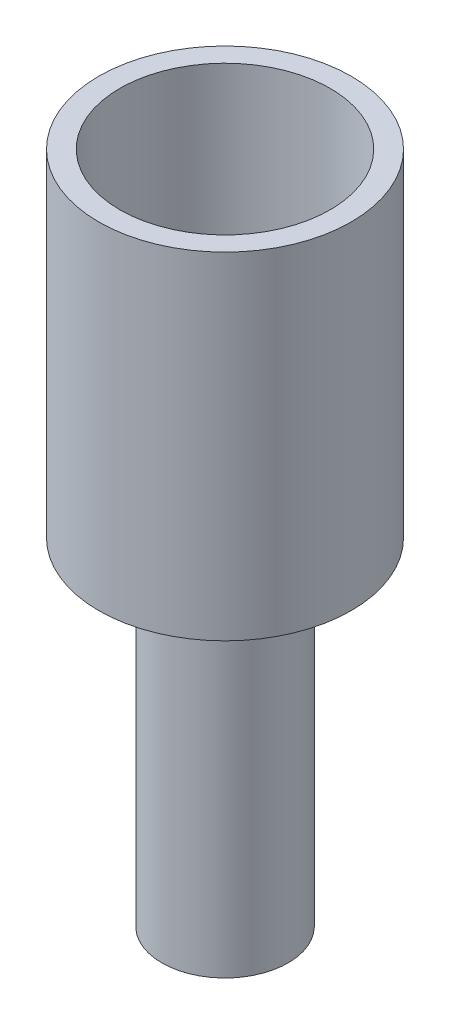
ISO-10303-21;
HEADER;
FILE_DESCRIPTION(('STEP AP214'),'2;1');
FILE_NAME('part.step','',(''),(''),'','','');
FILE_SCHEMA(('AUTOMOTIVE_DESIGN { 1 0 10303 214 1 1 1 1 }'));
ENDSEC;
DATA;
#1=APPLICATION_CONTEXT('core data for automotive mechanical design processes');
#2=APPLICATION_PROTOCOL_DEFINITION('international standard','automotive_design',2000,#1);
#3=PRODUCT_CONTEXT('',#1,'mechanical');
#4=PRODUCT('Part','Part','',(#3));
#5=PRODUCT_RELATED_PRODUCT_CATEGORY('part','',(#4));
#6=PRODUCT_DEFINITION_FORMATION('','',#4);
#7=PRODUCT_DEFINITION_CONTEXT('part definition',#1,'design');
#8=PRODUCT_DEFINITION('design','',#6,#7);
#9=PRODUCT_DEFINITION_SHAPE('','',#8);
#10=(LENGTH_UNIT() NAMED_UNIT(*) SI_UNIT(.MILLI.,.METRE.));
#11=(NAMED_UNIT(*) PLANE_ANGLE_UNIT() SI_UNIT($,.RADIAN.));
#12=(NAMED_UNIT(*) SI_UNIT($,.STERADIAN.) SOLID_ANGLE_UNIT());
#13=UNCERTAINTY_MEASURE_WITH_UNIT(LENGTH_MEASURE(1.E-05),#10,'distance_accuracy_value','');
#14=(GEOMETRIC_REPRESENTATION_CONTEXT(3) GLOBAL_UNCERTAINTY_ASSIGNED_CONTEXT((#13)) GLOBAL_UNIT_ASSIGNED_CONTEXT((#10,
#11,#12)) REPRESENTATION_CONTEXT('',''));
#15=CARTESIAN_POINT('',(0.,0.,0.));
#16=DIRECTION('',(0.,0.,1.));
#17=DIRECTION('',(1.,0.,0.));
#18=AXIS2_PLACEMENT_3D('',#15,#16,#17);
#19=CARTESIAN_POINT('',(0.,0.,0.));
#20=DIRECTION('',(0.,1.,0.));
#21=DIRECTION('',(0.,0.,1.));
#22=AXIS2_PLACEMENT_3D('',#19,#20,#21);
#23=PLANE('',#22);
#24=CARTESIAN_POINT('',(0.,0.,0.));
#25=DIRECTION('',(0.,1.,0.));
#26=DIRECTION('',(0.,0.,1.));
#27=AXIS2_PLACEMENT_3D('',#24,#25,#26);
#28=CIRCLE('',#27,4.7625);
#29=CARTESIAN_POINT('',(0.,0.,4.7625));
#30=VERTEX_POINT('',#29);
#31=EDGE_CURVE('E80',#30,#30,#28,.T.);
#32=ORIENTED_EDGE('',*,*,#31,.T.);
#33=EDGE_LOOP('',(#32));
#34=FACE_BOUND('',#33,.T.);
#35=CARTESIAN_POINT('',(0.,0.,0.));
#36=DIRECTION('',(0.,1.,0.));
#37=DIRECTION('',(0.,0.,1.));
#38=AXIS2_PLACEMENT_3D('',#35,#36,#37);
#39=CIRCLE('',#38,9.525);
#40=CARTESIAN_POINT('',(0.,0.,9.525));
#41=VERTEX_POINT('',#40);
#42=EDGE_CURVE('E73',#41,#41,#39,.T.);
#43=ORIENTED_EDGE('',*,*,#42,.F.);
#44=EDGE_LOOP('',(#43));
#45=FACE_BOUND('',#44,.T.);
#46=ADVANCED_FACE('F65',(#34,#45),#23,.F.);
#47=CARTESIAN_POINT('',(0.,25.4,0.));
#48=DIRECTION('',(0.,-1.,0.));
#49=DIRECTION('',(0.,0.,-1.));
#50=AXIS2_PLACEMENT_3D('',#47,#48,#49);
#51=CYLINDRICAL_SURFACE('',#50,9.525);
#52=CARTESIAN_POINT('',(0.,25.4,0.));
#53=DIRECTION('',(0.,1.,0.));
#54=DIRECTION('',(0.,0.,1.));
#55=AXIS2_PLACEMENT_3D('',#52,#53,#54);
#56=CIRCLE('',#55,9.525);
#57=CARTESIAN_POINT('',(0.,25.4,9.525));
#58=VERTEX_POINT('',#57);
#59=EDGE_CURVE('E11',#58,#58,#56,.T.);
#60=ORIENTED_EDGE('',*,*,#59,.F.);
#61=EDGE_LOOP('',(#60));
#62=FACE_BOUND('',#61,.T.);
#63=ORIENTED_EDGE('',*,*,#42,.T.);
#64=EDGE_LOOP('',(#63));
#65=FACE_BOUND('',#64,.T.);
#66=ADVANCED_FACE('F67',(#62,#65),#51,.T.);
#67=CARTESIAN_POINT('',(0.,25.4,0.));
#68=DIRECTION('',(0.,1.,0.));
#69=DIRECTION('',(0.,0.,1.));
#70=AXIS2_PLACEMENT_3D('',#67,#68,#69);
#71=PLANE('',#70);
#72=CARTESIAN_POINT('',(0.,25.4,0.));
#73=DIRECTION('',(0.,1.,0.));
#74=DIRECTION('',(0.,0.,1.));
#75=AXIS2_PLACEMENT_3D('',#72,#73,#74);
#76=CIRCLE('',#75,7.9375);
#77=CARTESIAN_POINT('',(0.,25.4,7.9375));
#78=VERTEX_POINT('',#77);
#79=EDGE_CURVE('E88',#78,#78,#76,.T.);
#80=ORIENTED_EDGE('',*,*,#79,.F.);
#81=EDGE_LOOP('',(#80));
#82=FACE_BOUND('',#81,.T.);
#83=ORIENTED_EDGE('',*,*,#59,.T.);
#84=EDGE_LOOP('',(#83));
#85=FACE_BOUND('',#84,.T.);
#86=ADVANCED_FACE('F112',(#82,#85),#71,.T.);
#87=CARTESIAN_POINT('',(0.,-25.4,0.));
#88=DIRECTION('',(0.,1.,0.));
#89=DIRECTION('',(0.,0.,1.));
#90=AXIS2_PLACEMENT_3D('',#87,#88,#89);
#91=CYLINDRICAL_SURFACE('',#90,4.7625);
#92=CARTESIAN_POINT('',(0.,-25.4,0.));
#93=DIRECTION('',(0.,1.,0.));
#94=DIRECTION('',(0.,0.,1.));
#95=AXIS2_PLACEMENT_3D('',#92,#93,#94);
#96=CIRCLE('',#95,4.7625);
#97=CARTESIAN_POINT('',(0.,-25.4,4.7625));
#98=VERTEX_POINT('',#97);
#99=EDGE_CURVE('E78',#98,#98,#96,.T.);
#100=ORIENTED_EDGE('',*,*,#99,.T.);
#101=EDGE_LOOP('',(#100));
#102=FACE_BOUND('',#101,.T.);
#103=ORIENTED_EDGE('',*,*,#31,.F.);
#104=EDGE_LOOP('',(#103));
#105=FACE_BOUND('',#104,.T.);
#106=ADVANCED_FACE('F118',(#102,#105),#91,.T.);
#107=CARTESIAN_POINT('',(0.,-25.4,0.));
#108=DIRECTION('',(0.,1.,0.));
#109=DIRECTION('',(0.,0.,1.));
#110=AXIS2_PLACEMENT_3D('',#107,#108,#109);
#111=PLANE('',#110);
#112=CARTESIAN_POINT('',(0.,-25.4,0.));
#113=DIRECTION('',(0.,-1.,0.));
#114=DIRECTION('',(0.,0.,-1.));
#115=AXIS2_PLACEMENT_3D('',#112,#113,#114);
#116=CIRCLE('',#115,3.17499999999999);
#117=CARTESIAN_POINT('',(0.,-25.4,-3.17499999999999));
#118=VERTEX_POINT('',#117);
#119=EDGE_CURVE('E91',#118,#118,#116,.T.);
#120=ORIENTED_EDGE('',*,*,#119,.F.);
#121=EDGE_LOOP('',(#120));
#122=FACE_BOUND('',#121,.T.);
#123=ORIENTED_EDGE('',*,*,#99,.F.);
#124=EDGE_LOOP('',(#123));
#125=FACE_BOUND('',#124,.T.);
#126=ADVANCED_FACE('F130',(#122,#125),#111,.F.);
#127=CARTESIAN_POINT('',(0.,4.76933116353126,0.));
#128=DIRECTION('',(0.,1.,0.));
#129=DIRECTION('',(0.,0.,1.));
#130=AXIS2_PLACEMENT_3D('',#127,#128,#129);
#131=CONICAL_SURFACE('',#130,7.93749999999999,1.02974425867665);
#132=CARTESIAN_POINT('',(0.,1.9077324654125,0.));
#133=DIRECTION('',(0.,1.,0.));
#134=DIRECTION('',(0.,0.,1.));
#135=AXIS2_PLACEMENT_3D('',#132,#133,#134);
#136=CIRCLE('',#135,3.17499999999998);
#137=CARTESIAN_POINT('',(0.,1.9077324654125,3.17499999999998));
#138=VERTEX_POINT('',#137);
#139=EDGE_CURVE('E69',#138,#138,#136,.F.);
#140=ORIENTED_EDGE('',*,*,#139,.T.);
#141=EDGE_LOOP('',(#140));
#142=FACE_BOUND('',#141,.T.);
#143=CARTESIAN_POINT('',(0.,4.76933116353126,0.));
#144=DIRECTION('',(0.,1.,0.));
#145=DIRECTION('',(0.,0.,1.));
#146=AXIS2_PLACEMENT_3D('',#143,#144,#145);
#147=CIRCLE('',#146,7.93749999999999);
#148=CARTESIAN_POINT('',(0.,4.76933116353126,7.93749999999999));
#149=VERTEX_POINT('',#148);
#150=EDGE_CURVE('E83',#149,#149,#147,.T.);
#151=ORIENTED_EDGE('',*,*,#150,.T.);
#152=EDGE_LOOP('',(#151));
#153=FACE_BOUND('',#152,.T.);
#154=ADVANCED_FACE('F98',(#142,#153),#131,.F.);
#155=CARTESIAN_POINT('',(0.,25.4,0.));
#156=DIRECTION('',(0.,1.,0.));
#157=DIRECTION('',(0.,0.,1.));
#158=AXIS2_PLACEMENT_3D('',#155,#156,#157);
#159=CYLINDRICAL_SURFACE('',#158,7.9375);
#160=ORIENTED_EDGE('',*,*,#150,.F.);
#161=EDGE_LOOP('',(#160));
#162=FACE_BOUND('',#161,.T.);
#163=ORIENTED_EDGE('',*,*,#79,.T.);
#164=EDGE_LOOP('',(#163));
#165=FACE_BOUND('',#164,.T.);
#166=ADVANCED_FACE('F103',(#162,#165),#159,.F.);
#167=CARTESIAN_POINT('',(0.,-25.4,0.));
#168=DIRECTION('',(0.,-1.,0.));
#169=DIRECTION('',(0.,0.,-1.));
#170=AXIS2_PLACEMENT_3D('',#167,#168,#169);
#171=CYLINDRICAL_SURFACE('',#170,3.17499999999998);
#172=ORIENTED_EDGE('',*,*,#119,.T.);
#173=EDGE_LOOP('',(#172));
#174=FACE_BOUND('',#173,.T.);
#175=ORIENTED_EDGE('',*,*,#139,.F.);
#176=EDGE_LOOP('',(#175));
#177=FACE_BOUND('',#176,.T.);
#178=ADVANCED_FACE('F101',(#174,#177),#171,.F.);
#179=CLOSED_SHELL('',(#46,#66,#86,#106,#126,#154,#166,#178));
#180=MANIFOLD_SOLID_BREP('B2',#179);
#181=ADVANCED_BREP_SHAPE_REPRESENTATION('',(#18,#180),#14);
#182=SHAPE_DEFINITION_REPRESENTATION(#9,#181);
ENDSEC;
END-ISO-10303-21;
